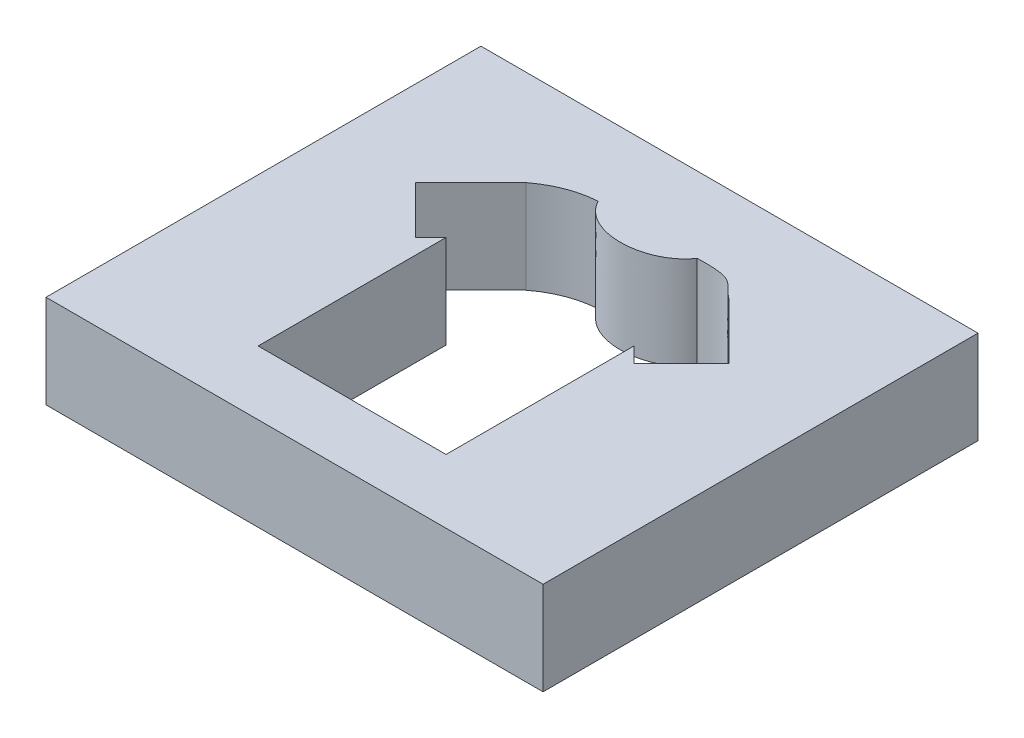
ISO-10303-21;
HEADER;
FILE_DESCRIPTION(('STEP AP214'),'2;1');
FILE_NAME('part.step','',(''),(''),'','','');
FILE_SCHEMA(('AUTOMOTIVE_DESIGN { 1 0 10303 214 1 1 1 1 }'));
ENDSEC;
DATA;
#1=APPLICATION_CONTEXT('core data for automotive mechanical design processes');
#2=APPLICATION_PROTOCOL_DEFINITION('international standard','automotive_design',2000,#1);
#3=PRODUCT_CONTEXT('',#1,'mechanical');
#4=PRODUCT('Part','Part','',(#3));
#5=PRODUCT_RELATED_PRODUCT_CATEGORY('part','',(#4));
#6=PRODUCT_DEFINITION_FORMATION('','',#4);
#7=PRODUCT_DEFINITION_CONTEXT('part definition',#1,'design');
#8=PRODUCT_DEFINITION('design','',#6,#7);
#9=PRODUCT_DEFINITION_SHAPE('','',#8);
#10=(LENGTH_UNIT() NAMED_UNIT(*) SI_UNIT(.MILLI.,.METRE.));
#11=(NAMED_UNIT(*) PLANE_ANGLE_UNIT() SI_UNIT($,.RADIAN.));
#12=(NAMED_UNIT(*) SI_UNIT($,.STERADIAN.) SOLID_ANGLE_UNIT());
#13=UNCERTAINTY_MEASURE_WITH_UNIT(LENGTH_MEASURE(1.E-05),#10,'distance_accuracy_value','');
#14=(GEOMETRIC_REPRESENTATION_CONTEXT(3) GLOBAL_UNCERTAINTY_ASSIGNED_CONTEXT((#13)) GLOBAL_UNIT_ASSIGNED_CONTEXT((#10,
#11,#12)) REPRESENTATION_CONTEXT('',''));
#15=CARTESIAN_POINT('',(0.,0.,0.));
#16=DIRECTION('',(0.,0.,1.));
#17=DIRECTION('',(1.,0.,0.));
#18=AXIS2_PLACEMENT_3D('',#15,#16,#17);
#19=CARTESIAN_POINT('',(0.,3.,0.));
#20=DIRECTION('',(0.,1.,0.));
#21=DIRECTION('',(0.,0.,1.));
#22=AXIS2_PLACEMENT_3D('',#19,#20,#21);
#23=PLANE('',#22);
#24=DIRECTION('',(0.,0.,1.));
#25=VECTOR('',#24,1.);
#26=CARTESIAN_POINT('',(-42.8025477707006,3.,-22.3184713375796));
#27=LINE('',#26,#25);
#28=CARTESIAN_POINT('',(-42.8025477707006,3.,-22.3184713375796));
#29=VERTEX_POINT('',#28);
#30=CARTESIAN_POINT('',(-42.8025477707006,3.,-8.31847133757962));
#31=VERTEX_POINT('',#30);
#32=EDGE_CURVE('E275',#29,#31,#27,.T.);
#33=ORIENTED_EDGE('',*,*,#32,.T.);
#34=DIRECTION('',(1.,0.,0.));
#35=VECTOR('',#34,1.);
#36=CARTESIAN_POINT('',(-42.8025477707006,3.,-8.31847133757962));
#37=LINE('',#36,#35);
#38=CARTESIAN_POINT('',(-26.8025477707006,3.,-8.31847133757962));
#39=VERTEX_POINT('',#38);
#40=EDGE_CURVE('E288',#31,#39,#37,.T.);
#41=ORIENTED_EDGE('',*,*,#40,.T.);
#42=DIRECTION('',(0.,0.,-1.));
#43=VECTOR('',#42,1.);
#44=CARTESIAN_POINT('',(-26.8025477707006,3.,-22.3184713375796));
#45=LINE('',#44,#43);
#46=CARTESIAN_POINT('',(-26.8025477707006,3.,-22.3184713375796));
#47=VERTEX_POINT('',#46);
#48=EDGE_CURVE('E269',#39,#47,#45,.T.);
#49=ORIENTED_EDGE('',*,*,#48,.T.);
#50=DIRECTION('',(-1.,0.,0.));
#51=VECTOR('',#50,1.);
#52=CARTESIAN_POINT('',(-42.8025477707006,3.,-22.3184713375796));
#53=LINE('',#52,#51);
#54=EDGE_CURVE('E282',#47,#29,#53,.T.);
#55=ORIENTED_EDGE('',*,*,#54,.T.);
#56=EDGE_LOOP('',(#33,#41,#49,#55));
#57=FACE_BOUND('',#56,.T.);
#58=DIRECTION('',(0.707106781186547,0.,0.707106781186547));
#59=VECTOR('',#58,1.);
#60=CARTESIAN_POINT('',(-40.0545132303044,3.,-17.459486991433));
#61=LINE('',#60,#59);
#62=CARTESIAN_POINT('',(-40.0545132303044,3.,-17.459486991433));
#63=VERTEX_POINT('',#62);
#64=CARTESIAN_POINT('',(-38.5246596038559,3.,-15.9296333649845));
#65=VERTEX_POINT('',#64);
#66=EDGE_CURVE('E154',#63,#65,#61,.T.);
#67=ORIENTED_EDGE('',*,*,#66,.F.);
#68=DIRECTION('',(-0.707106781186548,0.,0.707106781186548));
#69=VECTOR('',#68,1.);
#70=CARTESIAN_POINT('',(-40.0545132303044,3.,-17.459486991433));
#71=LINE('',#70,#69);
#72=CARTESIAN_POINT('',(-38.2775294026605,3.,-19.2364708190769));
#73=VERTEX_POINT('',#72);
#74=EDGE_CURVE('E146',#73,#63,#71,.T.);
#75=ORIENTED_EDGE('',*,*,#74,.F.);
#76=CARTESIAN_POINT('',(-36.594690413567,3.,-19.883716584113));
#77=CARTESIAN_POINT('',(-37.5290857439249,3.,-19.8134932141041));
#78=CARTESIAN_POINT('',(-38.2775294026605,3.,-19.2364708190769));
#79=B_SPLINE_CURVE_WITH_KNOTS('',2,(#76,#77,#78),.UNSPECIFIED.,.F.,.F.,(3,3),(0.,1.),.UNSPECIFIED.);
#80=CARTESIAN_POINT('',(-36.594690413567,3.,-19.883716584113));
#81=VERTEX_POINT('',#80);
#82=EDGE_CURVE('E312',#81,#73,#79,.T.);
#83=ORIENTED_EDGE('',*,*,#82,.F.);
#84=CARTESIAN_POINT('',(-33.4069993805894,3.,-19.883716584113));
#85=CARTESIAN_POINT('',(-34.0743202079596,3.,-18.9001313315757));
#86=CARTESIAN_POINT('',(-36.0095092401363,3.,-18.767110627594));
#87=CARTESIAN_POINT('',(-36.594690413567,3.,-19.883716584113));
#88=B_SPLINE_CURVE_WITH_KNOTS('',3,(#84,#85,#86,#87),.UNSPECIFIED.,.F.,.F.,(4,4),(0.,1.),.UNSPECIFIED.);
#89=CARTESIAN_POINT('',(-33.4069993805894,3.,-19.883716584113));
#90=VERTEX_POINT('',#89);
#91=EDGE_CURVE('E188',#90,#81,#88,.T.);
#92=ORIENTED_EDGE('',*,*,#91,.F.);
#93=CARTESIAN_POINT('',(-31.734463123388,3.,-19.236470819077));
#94=CARTESIAN_POINT('',(-32.3179660263049,3.,-19.6645171334207));
#95=CARTESIAN_POINT('',(-32.0905451868071,3.,-19.9276094103045));
#96=CARTESIAN_POINT('',(-33.4069993805894,3.,-19.883716584113));
#97=B_SPLINE_CURVE_WITH_KNOTS('',3,(#93,#94,#95,#96),.UNSPECIFIED.,.F.,.F.,(4,4),(0.,1.),.UNSPECIFIED.);
#98=CARTESIAN_POINT('',(-31.734463123388,3.,-19.236470819077));
#99=VERTEX_POINT('',#98);
#100=EDGE_CURVE('E183',#99,#90,#97,.T.);
#101=ORIENTED_EDGE('',*,*,#100,.F.);
#102=DIRECTION('',(-0.707106781186548,0.,-0.707106781186548));
#103=VECTOR('',#102,1.);
#104=CARTESIAN_POINT('',(-29.9574792957441,3.,-17.459486991433));
#105=LINE('',#104,#103);
#106=CARTESIAN_POINT('',(-29.9574792957441,3.,-17.459486991433));
#107=VERTEX_POINT('',#106);
#108=EDGE_CURVE('E181',#107,#99,#105,.T.);
#109=ORIENTED_EDGE('',*,*,#108,.F.);
#110=DIRECTION('',(0.707106781186547,0.,-0.707106781186548));
#111=VECTOR('',#110,1.);
#112=CARTESIAN_POINT('',(-31.4873329221925,3.,-15.9296333649845));
#113=LINE('',#112,#111);
#114=CARTESIAN_POINT('',(-31.4873329221925,3.,-15.9296333649845));
#115=VERTEX_POINT('',#114);
#116=EDGE_CURVE('E179',#115,#107,#113,.T.);
#117=ORIENTED_EDGE('',*,*,#116,.F.);
#118=DIRECTION('',(0.707106781186547,0.,0.707106781186547));
#119=VECTOR('',#118,1.);
#120=CARTESIAN_POINT('',(-31.9815933245836,3.,-16.4238937673756));
#121=LINE('',#120,#119);
#122=CARTESIAN_POINT('',(-31.9815933245836,3.,-16.4238937673756));
#123=VERTEX_POINT('',#122);
#124=EDGE_CURVE('E177',#123,#115,#121,.T.);
#125=ORIENTED_EDGE('',*,*,#124,.F.);
#126=DIRECTION('',(0.,0.,-1.));
#127=VECTOR('',#126,1.);
#128=CARTESIAN_POINT('',(-31.9815933245836,3.,-10.3750878904945));
#129=LINE('',#128,#127);
#130=CARTESIAN_POINT('',(-31.9815933245836,3.,-10.3750878904945));
#131=VERTEX_POINT('',#130);
#132=EDGE_CURVE('E175',#131,#123,#129,.T.);
#133=ORIENTED_EDGE('',*,*,#132,.F.);
#134=DIRECTION('',(1.,0.,0.));
#135=VECTOR('',#134,1.);
#136=CARTESIAN_POINT('',(-38.0303992014649,3.,-10.3750878904945));
#137=LINE('',#136,#135);
#138=CARTESIAN_POINT('',(-38.0303992014649,3.,-10.3750878904945));
#139=VERTEX_POINT('',#138);
#140=EDGE_CURVE('E173',#139,#131,#137,.T.);
#141=ORIENTED_EDGE('',*,*,#140,.F.);
#142=DIRECTION('',(0.,0.,1.));
#143=VECTOR('',#142,1.);
#144=CARTESIAN_POINT('',(-38.0303992014649,3.,-16.4238937673755));
#145=LINE('',#144,#143);
#146=CARTESIAN_POINT('',(-38.0303992014649,3.,-16.4238937673755));
#147=VERTEX_POINT('',#146);
#148=EDGE_CURVE('E169',#147,#139,#145,.T.);
#149=ORIENTED_EDGE('',*,*,#148,.F.);
#150=DIRECTION('',(0.707106781186548,0.,-0.707106781186548));
#151=VECTOR('',#150,1.);
#152=CARTESIAN_POINT('',(-38.5246596038559,3.,-15.9296333649845));
#153=LINE('',#152,#151);
#154=EDGE_CURVE('E167',#65,#147,#153,.T.);
#155=ORIENTED_EDGE('',*,*,#154,.F.);
#156=EDGE_LOOP('',(#67,#75,#83,#92,#101,#109,#117,#125,#133,#141,#149,#155));
#157=FACE_BOUND('',#156,.T.);
#158=ADVANCED_FACE('F33',(#57,#157),#23,.T.);
#159=CARTESIAN_POINT('',(0.,0.,0.));
#160=DIRECTION('',(0.,1.,0.));
#161=DIRECTION('',(0.,0.,1.));
#162=AXIS2_PLACEMENT_3D('',#159,#160,#161);
#163=PLANE('',#162);
#164=DIRECTION('',(0.,0.,1.));
#165=VECTOR('',#164,1.);
#166=CARTESIAN_POINT('',(-42.8025477707006,0.,-22.3184713375796));
#167=LINE('',#166,#165);
#168=CARTESIAN_POINT('',(-42.8025477707006,0.,-22.3184713375796));
#169=VERTEX_POINT('',#168);
#170=CARTESIAN_POINT('',(-42.8025477707006,0.,-8.31847133757962));
#171=VERTEX_POINT('',#170);
#172=EDGE_CURVE('E162',#169,#171,#167,.T.);
#173=ORIENTED_EDGE('',*,*,#172,.F.);
#174=DIRECTION('',(-1.,0.,0.));
#175=VECTOR('',#174,1.);
#176=CARTESIAN_POINT('',(-42.8025477707006,0.,-22.3184713375796));
#177=LINE('',#176,#175);
#178=CARTESIAN_POINT('',(-26.8025477707006,0.,-22.3184713375796));
#179=VERTEX_POINT('',#178);
#180=EDGE_CURVE('E273',#179,#169,#177,.T.);
#181=ORIENTED_EDGE('',*,*,#180,.F.);
#182=DIRECTION('',(0.,0.,-1.));
#183=VECTOR('',#182,1.);
#184=CARTESIAN_POINT('',(-26.8025477707006,0.,-22.3184713375796));
#185=LINE('',#184,#183);
#186=CARTESIAN_POINT('',(-26.8025477707006,0.,-8.31847133757962));
#187=VERTEX_POINT('',#186);
#188=EDGE_CURVE('E265',#187,#179,#185,.T.);
#189=ORIENTED_EDGE('',*,*,#188,.F.);
#190=DIRECTION('',(1.,0.,0.));
#191=VECTOR('',#190,1.);
#192=CARTESIAN_POINT('',(-42.8025477707006,0.,-8.31847133757962));
#193=LINE('',#192,#191);
#194=EDGE_CURVE('E258',#171,#187,#193,.T.);
#195=ORIENTED_EDGE('',*,*,#194,.F.);
#196=EDGE_LOOP('',(#173,#181,#189,#195));
#197=FACE_BOUND('',#196,.T.);
#198=DIRECTION('',(-0.707106781186548,0.,0.707106781186548));
#199=VECTOR('',#198,1.);
#200=CARTESIAN_POINT('',(-40.0545132303044,0.,-17.459486991433));
#201=LINE('',#200,#199);
#202=CARTESIAN_POINT('',(-38.2775294026605,0.,-19.2364708190769));
#203=VERTEX_POINT('',#202);
#204=CARTESIAN_POINT('',(-40.0545132303044,0.,-17.459486991433));
#205=VERTEX_POINT('',#204);
#206=EDGE_CURVE('E56',#203,#205,#201,.T.);
#207=ORIENTED_EDGE('',*,*,#206,.T.);
#208=DIRECTION('',(0.707106781186547,0.,0.707106781186547));
#209=VECTOR('',#208,1.);
#210=CARTESIAN_POINT('',(-40.0545132303044,0.,-17.459486991433));
#211=LINE('',#210,#209);
#212=CARTESIAN_POINT('',(-38.5246596038559,0.,-15.9296333649845));
#213=VERTEX_POINT('',#212);
#214=EDGE_CURVE('E161',#205,#213,#211,.T.);
#215=ORIENTED_EDGE('',*,*,#214,.T.);
#216=DIRECTION('',(0.707106781186548,0.,-0.707106781186548));
#217=VECTOR('',#216,1.);
#218=CARTESIAN_POINT('',(-38.5246596038559,0.,-15.9296333649845));
#219=LINE('',#218,#217);
#220=CARTESIAN_POINT('',(-38.0303992014649,0.,-16.4238937673755));
#221=VERTEX_POINT('',#220);
#222=EDGE_CURVE('E354',#213,#221,#219,.T.);
#223=ORIENTED_EDGE('',*,*,#222,.T.);
#224=DIRECTION('',(0.,0.,1.));
#225=VECTOR('',#224,1.);
#226=CARTESIAN_POINT('',(-38.0303992014649,0.,-16.4238937673755));
#227=LINE('',#226,#225);
#228=CARTESIAN_POINT('',(-38.0303992014649,0.,-10.3750878904945));
#229=VERTEX_POINT('',#228);
#230=EDGE_CURVE('E351',#221,#229,#227,.T.);
#231=ORIENTED_EDGE('',*,*,#230,.T.);
#232=DIRECTION('',(1.,0.,0.));
#233=VECTOR('',#232,1.);
#234=CARTESIAN_POINT('',(-38.0303992014649,0.,-10.3750878904945));
#235=LINE('',#234,#233);
#236=CARTESIAN_POINT('',(-31.9815933245836,0.,-10.3750878904945));
#237=VERTEX_POINT('',#236);
#238=EDGE_CURVE('E348',#229,#237,#235,.T.);
#239=ORIENTED_EDGE('',*,*,#238,.T.);
#240=DIRECTION('',(0.,0.,-1.));
#241=VECTOR('',#240,1.);
#242=CARTESIAN_POINT('',(-31.9815933245836,0.,-10.3750878904945));
#243=LINE('',#242,#241);
#244=CARTESIAN_POINT('',(-31.9815933245836,0.,-16.4238937673756));
#245=VERTEX_POINT('',#244);
#246=EDGE_CURVE('E345',#237,#245,#243,.T.);
#247=ORIENTED_EDGE('',*,*,#246,.T.);
#248=DIRECTION('',(0.707106781186547,0.,0.707106781186547));
#249=VECTOR('',#248,1.);
#250=CARTESIAN_POINT('',(-31.9815933245836,0.,-16.4238937673756));
#251=LINE('',#250,#249);
#252=CARTESIAN_POINT('',(-31.4873329221925,0.,-15.9296333649845));
#253=VERTEX_POINT('',#252);
#254=EDGE_CURVE('E342',#245,#253,#251,.T.);
#255=ORIENTED_EDGE('',*,*,#254,.T.);
#256=DIRECTION('',(0.707106781186547,0.,-0.707106781186548));
#257=VECTOR('',#256,1.);
#258=CARTESIAN_POINT('',(-31.4873329221925,0.,-15.9296333649845));
#259=LINE('',#258,#257);
#260=CARTESIAN_POINT('',(-29.9574792957441,0.,-17.459486991433));
#261=VERTEX_POINT('',#260);
#262=EDGE_CURVE('E339',#253,#261,#259,.T.);
#263=ORIENTED_EDGE('',*,*,#262,.T.);
#264=DIRECTION('',(-0.707106781186548,0.,-0.707106781186548));
#265=VECTOR('',#264,1.);
#266=CARTESIAN_POINT('',(-29.9574792957441,0.,-17.459486991433));
#267=LINE('',#266,#265);
#268=CARTESIAN_POINT('',(-31.734463123388,0.,-19.236470819077));
#269=VERTEX_POINT('',#268);
#270=EDGE_CURVE('E333',#261,#269,#267,.T.);
#271=ORIENTED_EDGE('',*,*,#270,.T.);
#272=CARTESIAN_POINT('',(-31.734463123388,0.,-19.236470819077));
#273=CARTESIAN_POINT('',(-32.3179660263049,0.,-19.6645171334207));
#274=CARTESIAN_POINT('',(-32.0905451868071,0.,-19.9276094103045));
#275=CARTESIAN_POINT('',(-33.4069993805894,0.,-19.883716584113));
#276=B_SPLINE_CURVE_WITH_KNOTS('',3,(#272,#273,#274,#275),.UNSPECIFIED.,.F.,.F.,(4,4),(0.,1.),.UNSPECIFIED.);
#277=CARTESIAN_POINT('',(-33.4069993805894,0.,-19.883716584113));
#278=VERTEX_POINT('',#277);
#279=EDGE_CURVE('E325',#269,#278,#276,.T.);
#280=ORIENTED_EDGE('',*,*,#279,.T.);
#281=CARTESIAN_POINT('',(-33.4069993805894,0.,-19.883716584113));
#282=CARTESIAN_POINT('',(-34.0743202079596,0.,-18.9001313315757));
#283=CARTESIAN_POINT('',(-36.0095092401363,0.,-18.767110627594));
#284=CARTESIAN_POINT('',(-36.594690413567,0.,-19.883716584113));
#285=B_SPLINE_CURVE_WITH_KNOTS('',3,(#281,#282,#283,#284),.UNSPECIFIED.,.F.,.F.,(4,4),(0.,1.),.UNSPECIFIED.);
#286=CARTESIAN_POINT('',(-36.594690413567,0.,-19.883716584113));
#287=VERTEX_POINT('',#286);
#288=EDGE_CURVE('E317',#278,#287,#285,.T.);
#289=ORIENTED_EDGE('',*,*,#288,.T.);
#290=CARTESIAN_POINT('',(-36.594690413567,0.,-19.883716584113));
#291=CARTESIAN_POINT('',(-37.5290857439249,0.,-19.8134932141041));
#292=CARTESIAN_POINT('',(-38.2775294026605,0.,-19.2364708190769));
#293=B_SPLINE_CURVE_WITH_KNOTS('',2,(#290,#291,#292),.UNSPECIFIED.,.F.,.F.,(3,3),(0.,1.),.UNSPECIFIED.);
#294=EDGE_CURVE('E155',#287,#203,#293,.T.);
#295=ORIENTED_EDGE('',*,*,#294,.T.);
#296=EDGE_LOOP('',(#207,#215,#223,#231,#239,#247,#255,#263,#271,#280,#289,#295));
#297=FACE_BOUND('',#296,.T.);
#298=ADVANCED_FACE('F239',(#197,#297),#163,.F.);
#299=CARTESIAN_POINT('',(-42.8025477707006,3.,-22.3184713375796));
#300=DIRECTION('',(1.,0.,0.));
#301=DIRECTION('',(0.,0.,-1.));
#302=AXIS2_PLACEMENT_3D('',#299,#300,#301);
#303=PLANE('',#302);
#304=ORIENTED_EDGE('',*,*,#172,.T.);
#305=DIRECTION('',(0.,-1.,0.));
#306=VECTOR('',#305,1.);
#307=CARTESIAN_POINT('',(-42.8025477707006,3.,-8.31847133757962));
#308=LINE('',#307,#306);
#309=EDGE_CURVE('E11',#31,#171,#308,.T.);
#310=ORIENTED_EDGE('',*,*,#309,.F.);
#311=ORIENTED_EDGE('',*,*,#32,.F.);
#312=DIRECTION('',(0.,-1.,0.));
#313=VECTOR('',#312,1.);
#314=CARTESIAN_POINT('',(-42.8025477707006,3.,-22.3184713375796));
#315=LINE('',#314,#313);
#316=EDGE_CURVE('E279',#29,#169,#315,.T.);
#317=ORIENTED_EDGE('',*,*,#316,.T.);
#318=EDGE_LOOP('',(#304,#310,#311,#317));
#319=FACE_BOUND('',#318,.T.);
#320=ADVANCED_FACE('F35',(#319),#303,.F.);
#321=CARTESIAN_POINT('',(-42.8025477707006,3.,-8.31847133757962));
#322=DIRECTION('',(0.,0.,-1.));
#323=DIRECTION('',(-1.,0.,0.));
#324=AXIS2_PLACEMENT_3D('',#321,#322,#323);
#325=PLANE('',#324);
#326=ORIENTED_EDGE('',*,*,#194,.T.);
#327=DIRECTION('',(0.,-1.,0.));
#328=VECTOR('',#327,1.);
#329=CARTESIAN_POINT('',(-26.8025477707006,3.,-8.31847133757962));
#330=LINE('',#329,#328);
#331=EDGE_CURVE('E41',#39,#187,#330,.T.);
#332=ORIENTED_EDGE('',*,*,#331,.F.);
#333=ORIENTED_EDGE('',*,*,#40,.F.);
#334=ORIENTED_EDGE('',*,*,#309,.T.);
#335=EDGE_LOOP('',(#326,#332,#333,#334));
#336=FACE_BOUND('',#335,.T.);
#337=ADVANCED_FACE('F249',(#336),#325,.F.);
#338=CARTESIAN_POINT('',(-26.8025477707006,3.,-22.3184713375796));
#339=DIRECTION('',(-1.,0.,0.));
#340=DIRECTION('',(0.,0.,1.));
#341=AXIS2_PLACEMENT_3D('',#338,#339,#340);
#342=PLANE('',#341);
#343=ORIENTED_EDGE('',*,*,#188,.T.);
#344=DIRECTION('',(0.,-1.,0.));
#345=VECTOR('',#344,1.);
#346=CARTESIAN_POINT('',(-26.8025477707006,3.,-22.3184713375796));
#347=LINE('',#346,#345);
#348=EDGE_CURVE('E270',#47,#179,#347,.T.);
#349=ORIENTED_EDGE('',*,*,#348,.F.);
#350=ORIENTED_EDGE('',*,*,#48,.F.);
#351=ORIENTED_EDGE('',*,*,#331,.T.);
#352=EDGE_LOOP('',(#343,#349,#350,#351));
#353=FACE_BOUND('',#352,.T.);
#354=ADVANCED_FACE('F246',(#353),#342,.F.);
#355=CARTESIAN_POINT('',(-42.8025477707006,3.,-22.3184713375796));
#356=DIRECTION('',(0.,0.,1.));
#357=DIRECTION('',(1.,0.,0.));
#358=AXIS2_PLACEMENT_3D('',#355,#356,#357);
#359=PLANE('',#358);
#360=ORIENTED_EDGE('',*,*,#180,.T.);
#361=ORIENTED_EDGE('',*,*,#316,.F.);
#362=ORIENTED_EDGE('',*,*,#54,.F.);
#363=ORIENTED_EDGE('',*,*,#348,.T.);
#364=EDGE_LOOP('',(#360,#361,#362,#363));
#365=FACE_BOUND('',#364,.T.);
#366=ADVANCED_FACE('F236',(#365),#359,.F.);
#367=CARTESIAN_POINT('',(-40.0545132303044,3.,-17.459486991433));
#368=DIRECTION('',(0.707106781186547,0.,0.707106781186547));
#369=DIRECTION('',(0.707106781186548,0.,-0.707106781186548));
#370=AXIS2_PLACEMENT_3D('',#367,#368,#369);
#371=PLANE('',#370);
#372=ORIENTED_EDGE('',*,*,#206,.F.);
#373=DIRECTION('',(0.,-1.,0.));
#374=VECTOR('',#373,1.);
#375=CARTESIAN_POINT('',(-38.2775294026605,3.,-19.2364708190769));
#376=LINE('',#375,#374);
#377=EDGE_CURVE('E150',#73,#203,#376,.T.);
#378=ORIENTED_EDGE('',*,*,#377,.F.);
#379=ORIENTED_EDGE('',*,*,#74,.T.);
#380=DIRECTION('',(0.,-1.,0.));
#381=VECTOR('',#380,1.);
#382=CARTESIAN_POINT('',(-40.0545132303044,3.,-17.459486991433));
#383=LINE('',#382,#381);
#384=EDGE_CURVE('E149',#63,#205,#383,.T.);
#385=ORIENTED_EDGE('',*,*,#384,.T.);
#386=EDGE_LOOP('',(#372,#378,#379,#385));
#387=FACE_BOUND('',#386,.T.);
#388=ADVANCED_FACE('F148',(#387),#371,.T.);
#389=CARTESIAN_POINT('',(-40.0545132303044,3.,-17.459486991433));
#390=DIRECTION('',(0.707106781186548,0.,-0.707106781186548));
#391=DIRECTION('',(-0.707106781186548,0.,-0.707106781186548));
#392=AXIS2_PLACEMENT_3D('',#389,#390,#391);
#393=PLANE('',#392);
#394=ORIENTED_EDGE('',*,*,#214,.F.);
#395=ORIENTED_EDGE('',*,*,#384,.F.);
#396=ORIENTED_EDGE('',*,*,#66,.T.);
#397=DIRECTION('',(0.,-1.,0.));
#398=VECTOR('',#397,1.);
#399=CARTESIAN_POINT('',(-38.5246596038559,3.,-15.9296333649845));
#400=LINE('',#399,#398);
#401=EDGE_CURVE('E163',#65,#213,#400,.T.);
#402=ORIENTED_EDGE('',*,*,#401,.T.);
#403=EDGE_LOOP('',(#394,#395,#396,#402));
#404=FACE_BOUND('',#403,.T.);
#405=ADVANCED_FACE('F158',(#404),#393,.T.);
#406=CARTESIAN_POINT('',(-38.5246596038559,3.,-15.9296333649845));
#407=DIRECTION('',(-0.707106781186547,0.,-0.707106781186547));
#408=DIRECTION('',(-0.707106781186548,0.,0.707106781186548));
#409=AXIS2_PLACEMENT_3D('',#406,#407,#408);
#410=PLANE('',#409);
#411=ORIENTED_EDGE('',*,*,#222,.F.);
#412=ORIENTED_EDGE('',*,*,#401,.F.);
#413=ORIENTED_EDGE('',*,*,#154,.T.);
#414=DIRECTION('',(0.,-1.,0.));
#415=VECTOR('',#414,1.);
#416=CARTESIAN_POINT('',(-38.0303992014649,3.,-16.4238937673755));
#417=LINE('',#416,#415);
#418=EDGE_CURVE('E294',#147,#221,#417,.T.);
#419=ORIENTED_EDGE('',*,*,#418,.T.);
#420=EDGE_LOOP('',(#411,#412,#413,#419));
#421=FACE_BOUND('',#420,.T.);
#422=ADVANCED_FACE('F227',(#421),#410,.T.);
#423=CARTESIAN_POINT('',(-38.0303992014649,3.,-16.4238937673755));
#424=DIRECTION('',(1.,0.,0.));
#425=DIRECTION('',(0.,0.,-1.));
#426=AXIS2_PLACEMENT_3D('',#423,#424,#425);
#427=PLANE('',#426);
#428=ORIENTED_EDGE('',*,*,#230,.F.);
#429=ORIENTED_EDGE('',*,*,#418,.F.);
#430=ORIENTED_EDGE('',*,*,#148,.T.);
#431=DIRECTION('',(0.,-1.,0.));
#432=VECTOR('',#431,1.);
#433=CARTESIAN_POINT('',(-38.0303992014649,3.,-10.3750878904945));
#434=LINE('',#433,#432);
#435=EDGE_CURVE('E296',#139,#229,#434,.T.);
#436=ORIENTED_EDGE('',*,*,#435,.T.);
#437=EDGE_LOOP('',(#428,#429,#430,#436));
#438=FACE_BOUND('',#437,.T.);
#439=ADVANCED_FACE('F223',(#438),#427,.T.);
#440=CARTESIAN_POINT('',(-38.0303992014649,3.,-10.3750878904945));
#441=DIRECTION('',(0.,0.,-1.));
#442=DIRECTION('',(-1.,0.,0.));
#443=AXIS2_PLACEMENT_3D('',#440,#441,#442);
#444=PLANE('',#443);
#445=ORIENTED_EDGE('',*,*,#238,.F.);
#446=ORIENTED_EDGE('',*,*,#435,.F.);
#447=ORIENTED_EDGE('',*,*,#140,.T.);
#448=DIRECTION('',(0.,-1.,0.));
#449=VECTOR('',#448,1.);
#450=CARTESIAN_POINT('',(-31.9815933245836,3.,-10.3750878904945));
#451=LINE('',#450,#449);
#452=EDGE_CURVE('E298',#131,#237,#451,.T.);
#453=ORIENTED_EDGE('',*,*,#452,.T.);
#454=EDGE_LOOP('',(#445,#446,#447,#453));
#455=FACE_BOUND('',#454,.T.);
#456=ADVANCED_FACE('F219',(#455),#444,.T.);
#457=CARTESIAN_POINT('',(-31.9815933245836,3.,-10.3750878904945));
#458=DIRECTION('',(-1.,0.,0.));
#459=DIRECTION('',(0.,0.,1.));
#460=AXIS2_PLACEMENT_3D('',#457,#458,#459);
#461=PLANE('',#460);
#462=ORIENTED_EDGE('',*,*,#246,.F.);
#463=ORIENTED_EDGE('',*,*,#452,.F.);
#464=ORIENTED_EDGE('',*,*,#132,.T.);
#465=DIRECTION('',(0.,-1.,0.));
#466=VECTOR('',#465,1.);
#467=CARTESIAN_POINT('',(-31.9815933245836,3.,-16.4238937673756));
#468=LINE('',#467,#466);
#469=EDGE_CURVE('E300',#123,#245,#468,.T.);
#470=ORIENTED_EDGE('',*,*,#469,.T.);
#471=EDGE_LOOP('',(#462,#463,#464,#470));
#472=FACE_BOUND('',#471,.T.);
#473=ADVANCED_FACE('F215',(#472),#461,.T.);
#474=CARTESIAN_POINT('',(-31.9815933245836,3.,-16.4238937673756));
#475=DIRECTION('',(0.707106781186548,0.,-0.707106781186548));
#476=DIRECTION('',(-0.707106781186548,0.,-0.707106781186548));
#477=AXIS2_PLACEMENT_3D('',#474,#475,#476);
#478=PLANE('',#477);
#479=ORIENTED_EDGE('',*,*,#254,.F.);
#480=ORIENTED_EDGE('',*,*,#469,.F.);
#481=ORIENTED_EDGE('',*,*,#124,.T.);
#482=DIRECTION('',(0.,-1.,0.));
#483=VECTOR('',#482,1.);
#484=CARTESIAN_POINT('',(-31.4873329221925,3.,-15.9296333649845));
#485=LINE('',#484,#483);
#486=EDGE_CURVE('E302',#115,#253,#485,.T.);
#487=ORIENTED_EDGE('',*,*,#486,.T.);
#488=EDGE_LOOP('',(#479,#480,#481,#487));
#489=FACE_BOUND('',#488,.T.);
#490=ADVANCED_FACE('F211',(#489),#478,.T.);
#491=CARTESIAN_POINT('',(-31.4873329221925,3.,-15.9296333649845));
#492=DIRECTION('',(-0.707106781186548,0.,-0.707106781186547));
#493=DIRECTION('',(-0.707106781186547,0.,0.707106781186548));
#494=AXIS2_PLACEMENT_3D('',#491,#492,#493);
#495=PLANE('',#494);
#496=ORIENTED_EDGE('',*,*,#262,.F.);
#497=ORIENTED_EDGE('',*,*,#486,.F.);
#498=ORIENTED_EDGE('',*,*,#116,.T.);
#499=DIRECTION('',(0.,-1.,0.));
#500=VECTOR('',#499,1.);
#501=CARTESIAN_POINT('',(-29.9574792957441,3.,-17.459486991433));
#502=LINE('',#501,#500);
#503=EDGE_CURVE('E304',#107,#261,#502,.T.);
#504=ORIENTED_EDGE('',*,*,#503,.T.);
#505=EDGE_LOOP('',(#496,#497,#498,#504));
#506=FACE_BOUND('',#505,.T.);
#507=ADVANCED_FACE('F207',(#506),#495,.T.);
#508=CARTESIAN_POINT('',(-29.9574792957441,3.,-17.459486991433));
#509=DIRECTION('',(-0.707106781186547,0.,0.707106781186547));
#510=DIRECTION('',(0.707106781186548,0.,0.707106781186548));
#511=AXIS2_PLACEMENT_3D('',#508,#509,#510);
#512=PLANE('',#511);
#513=ORIENTED_EDGE('',*,*,#270,.F.);
#514=ORIENTED_EDGE('',*,*,#503,.F.);
#515=ORIENTED_EDGE('',*,*,#108,.T.);
#516=DIRECTION('',(0.,-1.,0.));
#517=VECTOR('',#516,1.);
#518=CARTESIAN_POINT('',(-31.734463123388,3.,-19.236470819077));
#519=LINE('',#518,#517);
#520=EDGE_CURVE('E306',#99,#269,#519,.T.);
#521=ORIENTED_EDGE('',*,*,#520,.T.);
#522=EDGE_LOOP('',(#513,#514,#515,#521));
#523=FACE_BOUND('',#522,.T.);
#524=ADVANCED_FACE('F202',(#523),#512,.T.);
#525=DIRECTION('',(0.,-1.,0.));
#526=VECTOR('',#525,1.);
#527=SURFACE_OF_LINEAR_EXTRUSION('',#97,#526);
#528=ORIENTED_EDGE('',*,*,#279,.F.);
#529=ORIENTED_EDGE('',*,*,#520,.F.);
#530=ORIENTED_EDGE('',*,*,#100,.T.);
#531=DIRECTION('',(0.,-1.,0.));
#532=VECTOR('',#531,1.);
#533=CARTESIAN_POINT('',(-33.4069993805894,3.,-19.883716584113));
#534=LINE('',#533,#532);
#535=EDGE_CURVE('E308',#90,#278,#534,.T.);
#536=ORIENTED_EDGE('',*,*,#535,.T.);
#537=EDGE_LOOP('',(#528,#529,#530,#536));
#538=FACE_BOUND('',#537,.T.);
#539=ADVANCED_FACE('F197',(#538),#527,.T.);
#540=DIRECTION('',(0.,-1.,0.));
#541=VECTOR('',#540,1.);
#542=SURFACE_OF_LINEAR_EXTRUSION('',#88,#541);
#543=ORIENTED_EDGE('',*,*,#288,.F.);
#544=ORIENTED_EDGE('',*,*,#535,.F.);
#545=ORIENTED_EDGE('',*,*,#91,.T.);
#546=DIRECTION('',(0.,-1.,0.));
#547=VECTOR('',#546,1.);
#548=CARTESIAN_POINT('',(-36.594690413567,3.,-19.883716584113));
#549=LINE('',#548,#547);
#550=EDGE_CURVE('E48',#81,#287,#549,.T.);
#551=ORIENTED_EDGE('',*,*,#550,.T.);
#552=EDGE_LOOP('',(#543,#544,#545,#551));
#553=FACE_BOUND('',#552,.T.);
#554=ADVANCED_FACE('F201',(#553),#542,.T.);
#555=DIRECTION('',(0.,-1.,0.));
#556=VECTOR('',#555,1.);
#557=SURFACE_OF_LINEAR_EXTRUSION('',#79,#556);
#558=ORIENTED_EDGE('',*,*,#294,.F.);
#559=ORIENTED_EDGE('',*,*,#550,.F.);
#560=ORIENTED_EDGE('',*,*,#82,.T.);
#561=ORIENTED_EDGE('',*,*,#377,.T.);
#562=EDGE_LOOP('',(#558,#559,#560,#561));
#563=FACE_BOUND('',#562,.T.);
#564=ADVANCED_FACE('F364',(#563),#557,.T.);
#565=CLOSED_SHELL('',(#158,#298,#320,#337,#354,#366,#388,#405,#422,#439,#456,#473,#490,#507,
#524,#539,#554,#564));
#566=MANIFOLD_SOLID_BREP('B2',#565);
#567=ADVANCED_BREP_SHAPE_REPRESENTATION('',(#18,#566),#14);
#568=SHAPE_DEFINITION_REPRESENTATION(#9,#567);
ENDSEC;
END-ISO-10303-21;
